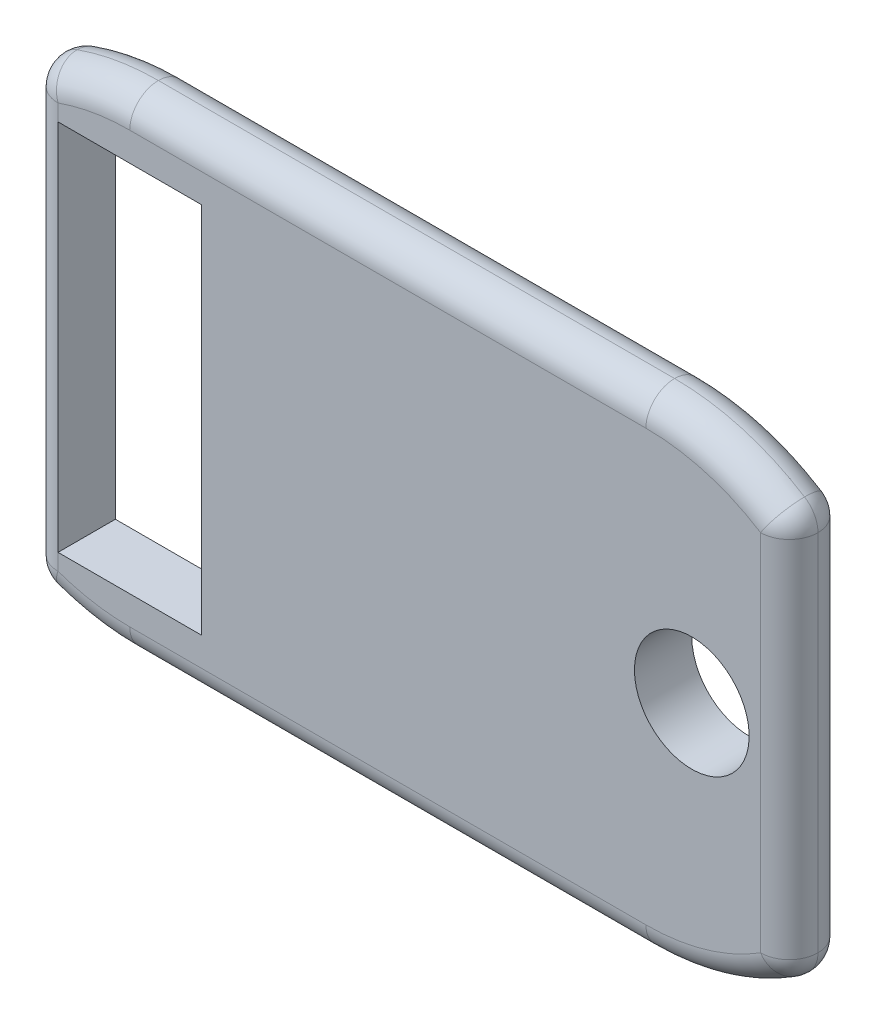
ISO-10303-21;
HEADER;
FILE_DESCRIPTION(('STEP AP214'),'2;1');
FILE_NAME('part.step','',(''),(''),'','','');
FILE_SCHEMA(('AUTOMOTIVE_DESIGN { 1 0 10303 214 1 1 1 1 }'));
ENDSEC;
DATA;
#1=APPLICATION_CONTEXT('core data for automotive mechanical design processes');
#2=APPLICATION_PROTOCOL_DEFINITION('international standard','automotive_design',2000,#1);
#3=PRODUCT_CONTEXT('',#1,'mechanical');
#4=PRODUCT('Part','Part','',(#3));
#5=PRODUCT_RELATED_PRODUCT_CATEGORY('part','',(#4));
#6=PRODUCT_DEFINITION_FORMATION('','',#4);
#7=PRODUCT_DEFINITION_CONTEXT('part definition',#1,'design');
#8=PRODUCT_DEFINITION('design','',#6,#7);
#9=PRODUCT_DEFINITION_SHAPE('','',#8);
#10=(LENGTH_UNIT() NAMED_UNIT(*) SI_UNIT(.MILLI.,.METRE.));
#11=(NAMED_UNIT(*) PLANE_ANGLE_UNIT() SI_UNIT($,.RADIAN.));
#12=(NAMED_UNIT(*) SI_UNIT($,.STERADIAN.) SOLID_ANGLE_UNIT());
#13=UNCERTAINTY_MEASURE_WITH_UNIT(LENGTH_MEASURE(1.E-05),#10,'distance_accuracy_value','');
#14=(GEOMETRIC_REPRESENTATION_CONTEXT(3) GLOBAL_UNCERTAINTY_ASSIGNED_CONTEXT((#13)) GLOBAL_UNIT_ASSIGNED_CONTEXT((#10,
#11,#12)) REPRESENTATION_CONTEXT('',''));
#15=CARTESIAN_POINT('',(0.,0.,0.));
#16=DIRECTION('',(0.,0.,1.));
#17=DIRECTION('',(1.,0.,0.));
#18=AXIS2_PLACEMENT_3D('',#15,#16,#17);
#19=CARTESIAN_POINT('',(38.6757267871688,-27.4690515955081,10.));
#20=DIRECTION('',(0.,0.,-1.));
#21=DIRECTION('',(-1.,0.,0.));
#22=AXIS2_PLACEMENT_3D('',#19,#20,#21);
#23=PLANE('',#22);
#24=DIRECTION('',(-1.,0.,0.));
#25=VECTOR('',#24,1.);
#26=CARTESIAN_POINT('',(38.6757267871688,-59.9690515955081,10.));
#27=LINE('',#26,#25);
#28=CARTESIAN_POINT('',(-38.8242732128312,-59.9690515955081,10.));
#29=VERTEX_POINT('',#28);
#30=CARTESIAN_POINT('',(-63.8242732128312,-59.9690515955081,10.));
#31=VERTEX_POINT('',#30);
#32=EDGE_CURVE('E321',#29,#31,#27,.T.);
#33=ORIENTED_EDGE('',*,*,#32,.T.);
#34=DIRECTION('',(0.,-1.,0.));
#35=VECTOR('',#34,1.);
#36=CARTESIAN_POINT('',(-63.8242732128312,-27.4690515955081,10.));
#37=LINE('',#36,#35);
#38=CARTESIAN_POINT('',(-63.8242732128312,-62.8243906548355,10.));
#39=VERTEX_POINT('',#38);
#40=EDGE_CURVE('E344',#31,#39,#37,.T.);
#41=ORIENTED_EDGE('',*,*,#40,.T.);
#42=CARTESIAN_POINT('',(-51.3242732128312,-27.4690515955081,10.));
#43=DIRECTION('',(0.,0.,-1.));
#44=DIRECTION('',(-1.,0.,0.));
#45=AXIS2_PLACEMENT_3D('',#42,#43,#44);
#46=CIRCLE('',#45,37.5);
#47=CARTESIAN_POINT('',(-51.3242732128312,-64.9690515955081,10.));
#48=VERTEX_POINT('',#47);
#49=EDGE_CURVE('E341',#39,#48,#46,.F.);
#50=ORIENTED_EDGE('',*,*,#49,.T.);
#51=DIRECTION('',(1.,0.,0.));
#52=VECTOR('',#51,1.);
#53=CARTESIAN_POINT('',(38.6757267871688,-64.9690515955081,10.));
#54=LINE('',#53,#52);
#55=CARTESIAN_POINT('',(38.6757267871688,-64.9690515955081,10.));
#56=VERTEX_POINT('',#55);
#57=EDGE_CURVE('E339',#48,#56,#54,.T.);
#58=ORIENTED_EDGE('',*,*,#57,.T.);
#59=CARTESIAN_POINT('',(38.6757267871688,-27.4690515955081,10.));
#60=DIRECTION('',(0.,0.,-1.));
#61=DIRECTION('',(-1.,0.,0.));
#62=AXIS2_PLACEMENT_3D('',#59,#60,#61);
#63=CIRCLE('',#62,37.5);
#64=CARTESIAN_POINT('',(58.6757267871688,-59.1904954466319,10.));
#65=VERTEX_POINT('',#64);
#66=EDGE_CURVE('E337',#56,#65,#63,.F.);
#67=ORIENTED_EDGE('',*,*,#66,.T.);
#68=DIRECTION('',(0.,1.,0.));
#69=VECTOR('',#68,1.);
#70=CARTESIAN_POINT('',(58.6757267871688,-27.4690515955081,10.));
#71=LINE('',#70,#69);
#72=CARTESIAN_POINT('',(58.6757267871688,4.25239225561574,10.));
#73=VERTEX_POINT('',#72);
#74=EDGE_CURVE('E335',#65,#73,#71,.T.);
#75=ORIENTED_EDGE('',*,*,#74,.T.);
#76=CARTESIAN_POINT('',(38.6757267871688,-27.4690515955081,10.));
#77=DIRECTION('',(0.,0.,-1.));
#78=DIRECTION('',(-1.,0.,0.));
#79=AXIS2_PLACEMENT_3D('',#76,#77,#78);
#80=CIRCLE('',#79,37.5);
#81=CARTESIAN_POINT('',(38.6757267871688,10.030948404492,10.));
#82=VERTEX_POINT('',#81);
#83=EDGE_CURVE('E333',#73,#82,#80,.F.);
#84=ORIENTED_EDGE('',*,*,#83,.T.);
#85=DIRECTION('',(-1.,0.,0.));
#86=VECTOR('',#85,1.);
#87=CARTESIAN_POINT('',(38.6757267871688,10.030948404492,10.));
#88=LINE('',#87,#86);
#89=CARTESIAN_POINT('',(-51.3242732128312,10.030948404492,10.));
#90=VERTEX_POINT('',#89);
#91=EDGE_CURVE('E329',#82,#90,#88,.T.);
#92=ORIENTED_EDGE('',*,*,#91,.T.);
#93=CARTESIAN_POINT('',(-51.3242732128312,-27.4690515955081,10.));
#94=DIRECTION('',(0.,0.,-1.));
#95=DIRECTION('',(-1.,0.,0.));
#96=AXIS2_PLACEMENT_3D('',#93,#94,#95);
#97=CIRCLE('',#96,37.5);
#98=CARTESIAN_POINT('',(-63.8242732128312,7.88628746381934,10.));
#99=VERTEX_POINT('',#98);
#100=EDGE_CURVE('E327',#90,#99,#97,.F.);
#101=ORIENTED_EDGE('',*,*,#100,.T.);
#102=DIRECTION('',(0.,-1.,0.));
#103=VECTOR('',#102,1.);
#104=CARTESIAN_POINT('',(-63.8242732128312,-27.4690515955081,10.));
#105=LINE('',#104,#103);
#106=CARTESIAN_POINT('',(-63.8242732128312,5.03094840449193,10.));
#107=VERTEX_POINT('',#106);
#108=EDGE_CURVE('E331',#99,#107,#105,.T.);
#109=ORIENTED_EDGE('',*,*,#108,.T.);
#110=DIRECTION('',(1.,0.,0.));
#111=VECTOR('',#110,1.);
#112=CARTESIAN_POINT('',(38.6757267871688,5.03094840449195,10.));
#113=LINE('',#112,#111);
#114=CARTESIAN_POINT('',(-38.8242732128312,5.03094840449194,10.));
#115=VERTEX_POINT('',#114);
#116=EDGE_CURVE('E310',#107,#115,#113,.T.);
#117=ORIENTED_EDGE('',*,*,#116,.T.);
#118=DIRECTION('',(0.,-1.,0.));
#119=VECTOR('',#118,1.);
#120=CARTESIAN_POINT('',(-38.8242732128312,-27.4690515955081,10.));
#121=LINE('',#120,#119);
#122=EDGE_CURVE('E318',#115,#29,#121,.T.);
#123=ORIENTED_EDGE('',*,*,#122,.T.);
#124=EDGE_LOOP('',(#33,#41,#50,#58,#67,#75,#84,#92,#101,#109,#117,#123));
#125=FACE_BOUND('',#124,.T.);
#126=CARTESIAN_POINT('',(46.6757267871688,-27.469051595508,10.));
#127=DIRECTION('',(0.,0.,-1.));
#128=DIRECTION('',(-1.,0.,0.));
#129=AXIS2_PLACEMENT_3D('',#126,#127,#128);
#130=CIRCLE('',#129,9.99999999999999);
#131=CARTESIAN_POINT('',(36.6757267871688,-27.469051595508,10.));
#132=VERTEX_POINT('',#131);
#133=EDGE_CURVE('E290',#132,#132,#130,.T.);
#134=ORIENTED_EDGE('',*,*,#133,.T.);
#135=EDGE_LOOP('',(#134));
#136=FACE_BOUND('',#135,.T.);
#137=ADVANCED_FACE('F32',(#125,#136),#23,.F.);
#138=CARTESIAN_POINT('',(38.6757267871688,-27.4690515955081,0.));
#139=DIRECTION('',(0.,0.,-1.));
#140=DIRECTION('',(-1.,0.,0.));
#141=AXIS2_PLACEMENT_3D('',#138,#139,#140);
#142=PLANE('',#141);
#143=CARTESIAN_POINT('',(46.6757267871688,-27.469051595508,0.));
#144=DIRECTION('',(0.,0.,-1.));
#145=DIRECTION('',(-1.,0.,0.));
#146=AXIS2_PLACEMENT_3D('',#143,#144,#145);
#147=CIRCLE('',#146,9.99999999999999);
#148=CARTESIAN_POINT('',(36.6757267871688,-27.469051595508,0.));
#149=VERTEX_POINT('',#148);
#150=EDGE_CURVE('E286',#149,#149,#147,.T.);
#151=ORIENTED_EDGE('',*,*,#150,.F.);
#152=EDGE_LOOP('',(#151));
#153=FACE_BOUND('',#152,.T.);
#154=CARTESIAN_POINT('',(-51.3242732128312,-27.4690515955081,0.));
#155=DIRECTION('',(0.,0.,-1.));
#156=DIRECTION('',(-1.,0.,0.));
#157=AXIS2_PLACEMENT_3D('',#154,#155,#156);
#158=CIRCLE('',#157,37.5);
#159=CARTESIAN_POINT('',(-51.3242732128312,-64.9690515955081,0.));
#160=VERTEX_POINT('',#159);
#161=CARTESIAN_POINT('',(-63.8242732128312,-62.8243906548355,0.));
#162=VERTEX_POINT('',#161);
#163=EDGE_CURVE('E42',#160,#162,#158,.T.);
#164=ORIENTED_EDGE('',*,*,#163,.T.);
#165=DIRECTION('',(0.,-1.,0.));
#166=VECTOR('',#165,1.);
#167=CARTESIAN_POINT('',(-63.8242732128312,11.2607818665661,0.));
#168=LINE('',#167,#166);
#169=CARTESIAN_POINT('',(-63.8242732128312,-59.9690515955081,0.));
#170=VERTEX_POINT('',#169);
#171=EDGE_CURVE('E11',#162,#170,#168,.F.);
#172=ORIENTED_EDGE('',*,*,#171,.T.);
#173=DIRECTION('',(-1.,0.,0.));
#174=VECTOR('',#173,1.);
#175=CARTESIAN_POINT('',(-38.8242732128312,-59.9690515955081,0.));
#176=LINE('',#175,#174);
#177=CARTESIAN_POINT('',(-38.8242732128312,-59.9690515955081,0.));
#178=VERTEX_POINT('',#177);
#179=EDGE_CURVE('E303',#178,#170,#176,.T.);
#180=ORIENTED_EDGE('',*,*,#179,.F.);
#181=DIRECTION('',(0.,-1.,0.));
#182=VECTOR('',#181,1.);
#183=CARTESIAN_POINT('',(-38.8242732128312,-59.9690515955081,0.));
#184=LINE('',#183,#182);
#185=CARTESIAN_POINT('',(-38.8242732128312,5.03094840449194,0.));
#186=VERTEX_POINT('',#185);
#187=EDGE_CURVE('E301',#186,#178,#184,.T.);
#188=ORIENTED_EDGE('',*,*,#187,.F.);
#189=DIRECTION('',(1.,0.,0.));
#190=VECTOR('',#189,1.);
#191=CARTESIAN_POINT('',(-38.8242732128312,5.03094840449194,0.));
#192=LINE('',#191,#190);
#193=CARTESIAN_POINT('',(-63.8242732128312,5.03094840449194,0.));
#194=VERTEX_POINT('',#193);
#195=EDGE_CURVE('E299',#194,#186,#192,.T.);
#196=ORIENTED_EDGE('',*,*,#195,.F.);
#197=DIRECTION('',(0.,-1.,0.));
#198=VECTOR('',#197,1.);
#199=CARTESIAN_POINT('',(-63.8242732128312,11.2607818665661,0.));
#200=LINE('',#199,#198);
#201=CARTESIAN_POINT('',(-63.8242732128312,7.88628746381934,0.));
#202=VERTEX_POINT('',#201);
#203=EDGE_CURVE('E350',#194,#202,#200,.F.);
#204=ORIENTED_EDGE('',*,*,#203,.T.);
#205=CARTESIAN_POINT('',(-51.3242732128312,-27.4690515955081,0.));
#206=DIRECTION('',(0.,0.,-1.));
#207=DIRECTION('',(-1.,0.,0.));
#208=AXIS2_PLACEMENT_3D('',#205,#206,#207);
#209=CIRCLE('',#208,37.5);
#210=CARTESIAN_POINT('',(-51.3242732128312,10.030948404492,0.));
#211=VERTEX_POINT('',#210);
#212=EDGE_CURVE('E346',#202,#211,#209,.T.);
#213=ORIENTED_EDGE('',*,*,#212,.T.);
#214=DIRECTION('',(-1.,0.,0.));
#215=VECTOR('',#214,1.);
#216=CARTESIAN_POINT('',(38.6757267871688,10.0309484044919,0.));
#217=LINE('',#216,#215);
#218=CARTESIAN_POINT('',(38.6757267871688,10.0309484044919,0.));
#219=VERTEX_POINT('',#218);
#220=EDGE_CURVE('E348',#211,#219,#217,.F.);
#221=ORIENTED_EDGE('',*,*,#220,.T.);
#222=CARTESIAN_POINT('',(38.6757267871688,-27.4690515955081,0.));
#223=DIRECTION('',(0.,0.,-1.));
#224=DIRECTION('',(-1.,0.,0.));
#225=AXIS2_PLACEMENT_3D('',#222,#223,#224);
#226=CIRCLE('',#225,37.5);
#227=CARTESIAN_POINT('',(58.6757267871688,4.25239225561574,0.));
#228=VERTEX_POINT('',#227);
#229=EDGE_CURVE('E352',#219,#228,#226,.T.);
#230=ORIENTED_EDGE('',*,*,#229,.T.);
#231=DIRECTION('',(0.,1.,0.));
#232=VECTOR('',#231,1.);
#233=CARTESIAN_POINT('',(58.6757267871688,-61.8383693076769,0.));
#234=LINE('',#233,#232);
#235=CARTESIAN_POINT('',(58.6757267871688,-59.1904954466319,0.));
#236=VERTEX_POINT('',#235);
#237=EDGE_CURVE('E174',#228,#236,#234,.F.);
#238=ORIENTED_EDGE('',*,*,#237,.T.);
#239=CARTESIAN_POINT('',(38.6757267871688,-27.4690515955081,0.));
#240=DIRECTION('',(0.,0.,-1.));
#241=DIRECTION('',(-1.,0.,0.));
#242=AXIS2_PLACEMENT_3D('',#239,#240,#241);
#243=CIRCLE('',#242,37.5);
#244=CARTESIAN_POINT('',(38.6757267871688,-64.9690515955081,0.));
#245=VERTEX_POINT('',#244);
#246=EDGE_CURVE('E166',#236,#245,#243,.T.);
#247=ORIENTED_EDGE('',*,*,#246,.T.);
#248=DIRECTION('',(1.,0.,0.));
#249=VECTOR('',#248,1.);
#250=CARTESIAN_POINT('',(-51.3242732128312,-64.9690515955081,0.));
#251=LINE('',#250,#249);
#252=EDGE_CURVE('E171',#245,#160,#251,.F.);
#253=ORIENTED_EDGE('',*,*,#252,.T.);
#254=EDGE_LOOP('',(#164,#172,#180,#188,#196,#204,#213,#221,#230,#238,#247,#253));
#255=FACE_BOUND('',#254,.T.);
#256=ADVANCED_FACE('F169',(#153,#255),#142,.T.);
#257=CARTESIAN_POINT('',(-63.8242732128312,-59.9690515955081,20.));
#258=DIRECTION('',(-1.,0.,0.));
#259=DIRECTION('',(0.,0.,1.));
#260=AXIS2_PLACEMENT_3D('',#257,#258,#259);
#261=PLANE('',#260);
#262=DIRECTION('',(0.,0.,-1.));
#263=VECTOR('',#262,1.);
#264=CARTESIAN_POINT('',(-63.8242732128312,-59.9690515955081,20.));
#265=LINE('',#264,#263);
#266=EDGE_CURVE('E307',#31,#170,#265,.T.);
#267=ORIENTED_EDGE('',*,*,#266,.T.);
#268=DIRECTION('',(0.,1.,0.));
#269=VECTOR('',#268,1.);
#270=CARTESIAN_POINT('',(-63.8242732128312,-59.9690515955081,0.));
#271=LINE('',#270,#269);
#272=EDGE_CURVE('E295',#170,#194,#271,.T.);
#273=ORIENTED_EDGE('',*,*,#272,.T.);
#274=DIRECTION('',(0.,0.,-1.));
#275=VECTOR('',#274,1.);
#276=CARTESIAN_POINT('',(-63.8242732128312,5.03094840449193,20.));
#277=LINE('',#276,#275);
#278=EDGE_CURVE('E306',#107,#194,#277,.T.);
#279=ORIENTED_EDGE('',*,*,#278,.F.);
#280=DIRECTION('',(0.,1.,0.));
#281=VECTOR('',#280,1.);
#282=CARTESIAN_POINT('',(-63.8242732128312,-27.4690515955081,10.));
#283=LINE('',#282,#281);
#284=EDGE_CURVE('E324',#31,#107,#283,.T.);
#285=ORIENTED_EDGE('',*,*,#284,.F.);
#286=EDGE_LOOP('',(#267,#273,#279,#285));
#287=FACE_BOUND('',#286,.T.);
#288=ADVANCED_FACE('F385',(#287),#261,.F.);
#289=CARTESIAN_POINT('',(-38.8242732128312,-59.9690515955081,20.));
#290=DIRECTION('',(0.,-1.,0.));
#291=DIRECTION('',(0.,0.,-1.));
#292=AXIS2_PLACEMENT_3D('',#289,#290,#291);
#293=PLANE('',#292);
#294=DIRECTION('',(0.,0.,-1.));
#295=VECTOR('',#294,1.);
#296=CARTESIAN_POINT('',(-38.8242732128312,-59.9690515955081,20.));
#297=LINE('',#296,#295);
#298=EDGE_CURVE('E311',#29,#178,#297,.T.);
#299=ORIENTED_EDGE('',*,*,#298,.T.);
#300=ORIENTED_EDGE('',*,*,#179,.T.);
#301=ORIENTED_EDGE('',*,*,#266,.F.);
#302=ORIENTED_EDGE('',*,*,#32,.F.);
#303=EDGE_LOOP('',(#299,#300,#301,#302));
#304=FACE_BOUND('',#303,.T.);
#305=ADVANCED_FACE('F388',(#304),#293,.F.);
#306=CARTESIAN_POINT('',(-38.8242732128312,-59.9690515955081,20.));
#307=DIRECTION('',(1.,0.,0.));
#308=DIRECTION('',(0.,0.,-1.));
#309=AXIS2_PLACEMENT_3D('',#306,#307,#308);
#310=PLANE('',#309);
#311=DIRECTION('',(0.,0.,-1.));
#312=VECTOR('',#311,1.);
#313=CARTESIAN_POINT('',(-38.8242732128312,5.03094840449194,20.));
#314=LINE('',#313,#312);
#315=EDGE_CURVE('E104',#115,#186,#314,.T.);
#316=ORIENTED_EDGE('',*,*,#315,.T.);
#317=ORIENTED_EDGE('',*,*,#187,.T.);
#318=ORIENTED_EDGE('',*,*,#298,.F.);
#319=ORIENTED_EDGE('',*,*,#122,.F.);
#320=EDGE_LOOP('',(#316,#317,#318,#319));
#321=FACE_BOUND('',#320,.T.);
#322=ADVANCED_FACE('F418',(#321),#310,.F.);
#323=CARTESIAN_POINT('',(-38.8242732128312,5.03094840449194,20.));
#324=DIRECTION('',(0.,1.,0.));
#325=DIRECTION('',(-1.,0.,0.));
#326=AXIS2_PLACEMENT_3D('',#323,#324,#325);
#327=PLANE('',#326);
#328=ORIENTED_EDGE('',*,*,#278,.T.);
#329=ORIENTED_EDGE('',*,*,#195,.T.);
#330=ORIENTED_EDGE('',*,*,#315,.F.);
#331=ORIENTED_EDGE('',*,*,#116,.F.);
#332=EDGE_LOOP('',(#328,#329,#330,#331));
#333=FACE_BOUND('',#332,.T.);
#334=ADVANCED_FACE('F417',(#333),#327,.F.);
#335=CARTESIAN_POINT('',(46.6757267871688,-27.469051595508,20.));
#336=DIRECTION('',(0.,0.,-1.));
#337=DIRECTION('',(-1.,0.,0.));
#338=AXIS2_PLACEMENT_3D('',#335,#336,#337);
#339=CYLINDRICAL_SURFACE('',#338,9.99999999999999);
#340=ORIENTED_EDGE('',*,*,#150,.T.);
#341=EDGE_LOOP('',(#340));
#342=FACE_BOUND('',#341,.T.);
#343=ORIENTED_EDGE('',*,*,#133,.F.);
#344=EDGE_LOOP('',(#343));
#345=FACE_BOUND('',#344,.T.);
#346=ADVANCED_FACE('F440',(#342,#345),#339,.F.);
#347=CARTESIAN_POINT('',(38.6757267871688,-27.4690515955081,5.));
#348=DIRECTION('',(0.,0.,-1.));
#349=DIRECTION('',(-1.,0.,0.));
#350=AXIS2_PLACEMENT_3D('',#347,#348,#349);
#351=TOROIDAL_SURFACE('',#350,37.5,5.);
#352=CARTESIAN_POINT('',(58.6757267871688,4.25239225561574,5.));
#353=DIRECTION('',(0.845905169363301,-0.533333333333334,0.));
#354=DIRECTION('',(0.533333333333334,0.845905169363301,0.));
#355=AXIS2_PLACEMENT_3D('',#352,#353,#354);
#356=CIRCLE('',#355,5.);
#357=CARTESIAN_POINT('',(61.3423934538355,8.48191810243224,5.));
#358=VERTEX_POINT('',#357);
#359=EDGE_CURVE('E280',#228,#358,#356,.T.);
#360=ORIENTED_EDGE('',*,*,#359,.F.);
#361=ORIENTED_EDGE('',*,*,#229,.F.);
#362=CARTESIAN_POINT('',(38.6757267871688,10.0309484044919,5.));
#363=DIRECTION('',(-1.,0.,0.));
#364=DIRECTION('',(0.,0.,1.));
#365=AXIS2_PLACEMENT_3D('',#362,#363,#364);
#366=CIRCLE('',#365,5.);
#367=CARTESIAN_POINT('',(38.6757267871688,15.0309484044919,5.));
#368=VERTEX_POINT('',#367);
#369=EDGE_CURVE('E36',#368,#219,#366,.T.);
#370=ORIENTED_EDGE('',*,*,#369,.F.);
#371=CARTESIAN_POINT('',(38.6757267871688,-27.4690515955081,5.));
#372=DIRECTION('',(0.,0.,-1.));
#373=DIRECTION('',(-1.,0.,0.));
#374=AXIS2_PLACEMENT_3D('',#371,#372,#373);
#375=CIRCLE('',#374,42.5);
#376=EDGE_CURVE('E95',#358,#368,#375,.F.);
#377=ORIENTED_EDGE('',*,*,#376,.F.);
#378=EDGE_LOOP('',(#360,#361,#370,#377));
#379=FACE_BOUND('',#378,.T.);
#380=ADVANCED_FACE('F34',(#379),#351,.T.);
#381=CARTESIAN_POINT('',(-51.3242732128312,10.030948404492,5.));
#382=DIRECTION('',(1.,0.,0.));
#383=DIRECTION('',(0.,1.,0.));
#384=AXIS2_PLACEMENT_3D('',#381,#382,#383);
#385=CYLINDRICAL_SURFACE('',#384,5.);
#386=ORIENTED_EDGE('',*,*,#369,.T.);
#387=ORIENTED_EDGE('',*,*,#220,.F.);
#388=CARTESIAN_POINT('',(-51.3242732128312,10.030948404492,5.));
#389=DIRECTION('',(-1.,0.,0.));
#390=DIRECTION('',(0.,0.,1.));
#391=AXIS2_PLACEMENT_3D('',#388,#389,#390);
#392=CIRCLE('',#391,5.);
#393=CARTESIAN_POINT('',(-51.3242732128312,15.030948404492,5.));
#394=VERTEX_POINT('',#393);
#395=EDGE_CURVE('E277',#394,#211,#392,.T.);
#396=ORIENTED_EDGE('',*,*,#395,.F.);
#397=DIRECTION('',(-1.,0.,0.));
#398=VECTOR('',#397,1.);
#399=CARTESIAN_POINT('',(-51.3242732128312,15.030948404492,5.));
#400=LINE('',#399,#398);
#401=EDGE_CURVE('E274',#368,#394,#400,.T.);
#402=ORIENTED_EDGE('',*,*,#401,.F.);
#403=EDGE_LOOP('',(#386,#387,#396,#402));
#404=FACE_BOUND('',#403,.T.);
#405=ADVANCED_FACE('F433',(#404),#385,.T.);
#406=CARTESIAN_POINT('',(38.6757267871688,-27.4690515955081,5.));
#407=DIRECTION('',(0.,0.,-1.));
#408=DIRECTION('',(-1.,0.,0.));
#409=AXIS2_PLACEMENT_3D('',#406,#407,#408);
#410=TOROIDAL_SURFACE('',#409,37.5,5.);
#411=CARTESIAN_POINT('',(58.6757267871688,4.25239225561573,5.));
#412=DIRECTION('',(0.845905169363301,-0.533333333333334,0.));
#413=DIRECTION('',(0.533333333333334,0.845905169363301,0.));
#414=AXIS2_PLACEMENT_3D('',#411,#412,#413);
#415=CIRCLE('',#414,5.);
#416=EDGE_CURVE('E268',#358,#73,#415,.T.);
#417=ORIENTED_EDGE('',*,*,#416,.F.);
#418=ORIENTED_EDGE('',*,*,#376,.T.);
#419=CARTESIAN_POINT('',(38.6757267871688,10.0309484044919,5.));
#420=DIRECTION('',(-1.,0.,0.));
#421=DIRECTION('',(0.,0.,1.));
#422=AXIS2_PLACEMENT_3D('',#419,#420,#421);
#423=CIRCLE('',#422,5.);
#424=EDGE_CURVE('E271',#82,#368,#423,.T.);
#425=ORIENTED_EDGE('',*,*,#424,.F.);
#426=ORIENTED_EDGE('',*,*,#83,.F.);
#427=EDGE_LOOP('',(#417,#418,#425,#426));
#428=FACE_BOUND('',#427,.T.);
#429=ADVANCED_FACE('F429',(#428),#410,.T.);
#430=CARTESIAN_POINT('',(58.6757267871688,4.25239225561574,5.));
#431=DIRECTION('',(0.,0.,1.));
#432=DIRECTION('',(1.,0.,0.));
#433=AXIS2_PLACEMENT_3D('',#430,#431,#432);
#434=SPHERICAL_SURFACE('',#433,5.);
#435=ORIENTED_EDGE('',*,*,#359,.T.);
#436=CARTESIAN_POINT('',(58.6757267871688,4.25239225561574,5.));
#437=DIRECTION('',(0.,0.,1.));
#438=DIRECTION('',(1.,0.,0.));
#439=AXIS2_PLACEMENT_3D('',#436,#437,#438);
#440=CIRCLE('',#439,5.);
#441=CARTESIAN_POINT('',(63.6757267871688,4.25239225561574,5.));
#442=VERTEX_POINT('',#441);
#443=EDGE_CURVE('E266',#442,#358,#440,.T.);
#444=ORIENTED_EDGE('',*,*,#443,.F.);
#445=CARTESIAN_POINT('',(58.6757267871688,4.25239225561574,5.));
#446=DIRECTION('',(0.,1.,0.));
#447=DIRECTION('',(0.,0.,1.));
#448=AXIS2_PLACEMENT_3D('',#445,#446,#447);
#449=CIRCLE('',#448,5.);
#450=EDGE_CURVE('E263',#228,#442,#449,.F.);
#451=ORIENTED_EDGE('',*,*,#450,.F.);
#452=EDGE_LOOP('',(#435,#444,#451));
#453=FACE_BOUND('',#452,.T.);
#454=ADVANCED_FACE('F355',(#453),#434,.T.);
#455=CARTESIAN_POINT('',(-51.3242732128312,-27.4690515955081,5.));
#456=DIRECTION('',(0.,0.,-1.));
#457=DIRECTION('',(-1.,0.,0.));
#458=AXIS2_PLACEMENT_3D('',#455,#456,#457);
#459=TOROIDAL_SURFACE('',#458,37.5,5.);
#460=ORIENTED_EDGE('',*,*,#395,.T.);
#461=ORIENTED_EDGE('',*,*,#212,.F.);
#462=CARTESIAN_POINT('',(-63.8242732128312,7.88628746381933,5.));
#463=DIRECTION('',(-0.942809041582064,-0.333333333333333,0.));
#464=DIRECTION('',(0.333333333333333,-0.942809041582064,0.));
#465=AXIS2_PLACEMENT_3D('',#462,#463,#464);
#466=CIRCLE('',#465,5.);
#467=CARTESIAN_POINT('',(-65.4909398794978,12.6003326717296,5.));
#468=VERTEX_POINT('',#467);
#469=EDGE_CURVE('E260',#468,#202,#466,.T.);
#470=ORIENTED_EDGE('',*,*,#469,.F.);
#471=CARTESIAN_POINT('',(-51.3242732128312,-27.4690515955081,5.));
#472=DIRECTION('',(0.,0.,-1.));
#473=DIRECTION('',(-1.,0.,0.));
#474=AXIS2_PLACEMENT_3D('',#471,#472,#473);
#475=CIRCLE('',#474,42.5);
#476=EDGE_CURVE('E254',#394,#468,#475,.F.);
#477=ORIENTED_EDGE('',*,*,#476,.F.);
#478=EDGE_LOOP('',(#460,#461,#470,#477));
#479=FACE_BOUND('',#478,.T.);
#480=ADVANCED_FACE('F396',(#479),#459,.T.);
#481=CARTESIAN_POINT('',(38.6757267871688,10.030948404492,5.));
#482=DIRECTION('',(-1.,0.,0.));
#483=DIRECTION('',(0.,-1.,0.));
#484=AXIS2_PLACEMENT_3D('',#481,#482,#483);
#485=CYLINDRICAL_SURFACE('',#484,5.);
#486=ORIENTED_EDGE('',*,*,#424,.T.);
#487=ORIENTED_EDGE('',*,*,#401,.T.);
#488=CARTESIAN_POINT('',(-51.3242732128312,10.030948404492,5.));
#489=DIRECTION('',(-1.,0.,0.));
#490=DIRECTION('',(0.,0.,1.));
#491=AXIS2_PLACEMENT_3D('',#488,#489,#490);
#492=CIRCLE('',#491,5.);
#493=EDGE_CURVE('E251',#90,#394,#492,.T.);
#494=ORIENTED_EDGE('',*,*,#493,.F.);
#495=ORIENTED_EDGE('',*,*,#91,.F.);
#496=EDGE_LOOP('',(#486,#487,#494,#495));
#497=FACE_BOUND('',#496,.T.);
#498=ADVANCED_FACE('F432',(#497),#485,.T.);
#499=CARTESIAN_POINT('',(58.6757267871688,4.25239225561574,5.));
#500=DIRECTION('',(0.,0.,1.));
#501=DIRECTION('',(1.,0.,0.));
#502=AXIS2_PLACEMENT_3D('',#499,#500,#501);
#503=SPHERICAL_SURFACE('',#502,5.);
#504=ORIENTED_EDGE('',*,*,#443,.T.);
#505=ORIENTED_EDGE('',*,*,#416,.T.);
#506=CARTESIAN_POINT('',(58.6757267871688,4.25239225561574,5.));
#507=DIRECTION('',(0.,1.,0.));
#508=DIRECTION('',(-1.,0.,0.));
#509=AXIS2_PLACEMENT_3D('',#506,#507,#508);
#510=CIRCLE('',#509,5.);
#511=EDGE_CURVE('E248',#442,#73,#510,.F.);
#512=ORIENTED_EDGE('',*,*,#511,.F.);
#513=EDGE_LOOP('',(#504,#505,#512));
#514=FACE_BOUND('',#513,.T.);
#515=ADVANCED_FACE('F428',(#514),#503,.T.);
#516=CARTESIAN_POINT('',(58.6757267871688,-61.8383693076769,5.));
#517=DIRECTION('',(0.,-1.,0.));
#518=DIRECTION('',(0.,0.,-1.));
#519=AXIS2_PLACEMENT_3D('',#516,#517,#518);
#520=CYLINDRICAL_SURFACE('',#519,5.);
#521=ORIENTED_EDGE('',*,*,#237,.F.);
#522=ORIENTED_EDGE('',*,*,#450,.T.);
#523=DIRECTION('',(0.,1.,0.));
#524=VECTOR('',#523,1.);
#525=CARTESIAN_POINT('',(63.6757267871688,6.90026611666073,5.));
#526=LINE('',#525,#524);
#527=CARTESIAN_POINT('',(63.6757267871688,-59.1904954466319,5.));
#528=VERTEX_POINT('',#527);
#529=EDGE_CURVE('E245',#528,#442,#526,.T.);
#530=ORIENTED_EDGE('',*,*,#529,.F.);
#531=CARTESIAN_POINT('',(58.6757267871688,-59.1904954466319,5.));
#532=DIRECTION('',(0.,-1.,0.));
#533=DIRECTION('',(1.,0.,0.));
#534=AXIS2_PLACEMENT_3D('',#531,#532,#533);
#535=CIRCLE('',#534,5.);
#536=EDGE_CURVE('E242',#236,#528,#535,.T.);
#537=ORIENTED_EDGE('',*,*,#536,.F.);
#538=EDGE_LOOP('',(#521,#522,#530,#537));
#539=FACE_BOUND('',#538,.T.);
#540=ADVANCED_FACE('F358',(#539),#520,.T.);
#541=CARTESIAN_POINT('',(-63.8242732128312,7.88628746381934,5.));
#542=DIRECTION('',(0.,0.,1.));
#543=DIRECTION('',(1.,0.,0.));
#544=AXIS2_PLACEMENT_3D('',#541,#542,#543);
#545=SPHERICAL_SURFACE('',#544,5.);
#546=CARTESIAN_POINT('',(-63.8242732128312,7.88628746381934,5.));
#547=DIRECTION('',(0.,0.,-1.));
#548=DIRECTION('',(-1.,0.,0.));
#549=AXIS2_PLACEMENT_3D('',#546,#547,#548);
#550=CIRCLE('',#549,5.);
#551=CARTESIAN_POINT('',(-68.8242732128312,7.88628746381934,5.));
#552=VERTEX_POINT('',#551);
#553=EDGE_CURVE('E257',#468,#552,#550,.F.);
#554=ORIENTED_EDGE('',*,*,#553,.F.);
#555=ORIENTED_EDGE('',*,*,#469,.T.);
#556=CARTESIAN_POINT('',(-63.8242732128312,7.88628746381934,5.));
#557=DIRECTION('',(0.,1.,0.));
#558=DIRECTION('',(-1.,0.,0.));
#559=AXIS2_PLACEMENT_3D('',#556,#557,#558);
#560=CIRCLE('',#559,5.);
#561=EDGE_CURVE('E239',#552,#202,#560,.F.);
#562=ORIENTED_EDGE('',*,*,#561,.F.);
#563=EDGE_LOOP('',(#554,#555,#562));
#564=FACE_BOUND('',#563,.T.);
#565=ADVANCED_FACE('F400',(#564),#545,.T.);
#566=CARTESIAN_POINT('',(-51.3242732128312,-27.4690515955081,5.));
#567=DIRECTION('',(0.,0.,-1.));
#568=DIRECTION('',(-1.,0.,0.));
#569=AXIS2_PLACEMENT_3D('',#566,#567,#568);
#570=TOROIDAL_SURFACE('',#569,37.5,5.);
#571=ORIENTED_EDGE('',*,*,#493,.T.);
#572=ORIENTED_EDGE('',*,*,#476,.T.);
#573=CARTESIAN_POINT('',(-63.8242732128312,7.88628746381934,5.));
#574=DIRECTION('',(-0.942809041582063,-0.333333333333333,0.));
#575=DIRECTION('',(0.333333333333333,-0.942809041582063,0.));
#576=AXIS2_PLACEMENT_3D('',#573,#574,#575);
#577=CIRCLE('',#576,5.);
#578=EDGE_CURVE('E236',#99,#468,#577,.T.);
#579=ORIENTED_EDGE('',*,*,#578,.F.);
#580=ORIENTED_EDGE('',*,*,#100,.F.);
#581=EDGE_LOOP('',(#571,#572,#579,#580));
#582=FACE_BOUND('',#581,.T.);
#583=ADVANCED_FACE('F405',(#582),#570,.T.);
#584=CARTESIAN_POINT('',(58.6757267871688,-27.4690515955081,5.));
#585=DIRECTION('',(0.,1.,0.));
#586=DIRECTION('',(0.,0.,1.));
#587=AXIS2_PLACEMENT_3D('',#584,#585,#586);
#588=CYLINDRICAL_SURFACE('',#587,5.);
#589=CARTESIAN_POINT('',(58.6757267871688,-59.1904954466319,5.));
#590=DIRECTION('',(0.,-1.,0.));
#591=DIRECTION('',(0.,0.,-1.));
#592=AXIS2_PLACEMENT_3D('',#589,#590,#591);
#593=CIRCLE('',#592,5.);
#594=EDGE_CURVE('E233',#528,#65,#593,.T.);
#595=ORIENTED_EDGE('',*,*,#594,.F.);
#596=ORIENTED_EDGE('',*,*,#529,.T.);
#597=ORIENTED_EDGE('',*,*,#511,.T.);
#598=ORIENTED_EDGE('',*,*,#74,.F.);
#599=EDGE_LOOP('',(#595,#596,#597,#598));
#600=FACE_BOUND('',#599,.T.);
#601=ADVANCED_FACE('F426',(#600),#588,.T.);
#602=CARTESIAN_POINT('',(58.6757267871688,-59.1904954466319,5.));
#603=DIRECTION('',(0.,0.,1.));
#604=DIRECTION('',(1.,0.,0.));
#605=AXIS2_PLACEMENT_3D('',#602,#603,#604);
#606=SPHERICAL_SURFACE('',#605,5.);
#607=ORIENTED_EDGE('',*,*,#536,.T.);
#608=CARTESIAN_POINT('',(58.6757267871688,-59.1904954466319,5.));
#609=DIRECTION('',(0.,0.,1.));
#610=DIRECTION('',(1.,0.,0.));
#611=AXIS2_PLACEMENT_3D('',#608,#609,#610);
#612=CIRCLE('',#611,5.);
#613=CARTESIAN_POINT('',(61.3423934538355,-63.4200212934484,5.));
#614=VERTEX_POINT('',#613);
#615=EDGE_CURVE('E230',#614,#528,#612,.T.);
#616=ORIENTED_EDGE('',*,*,#615,.F.);
#617=CARTESIAN_POINT('',(58.6757267871688,-59.1904954466319,5.));
#618=DIRECTION('',(0.845905169363301,0.533333333333334,0.));
#619=DIRECTION('',(-0.533333333333334,0.845905169363301,0.));
#620=AXIS2_PLACEMENT_3D('',#617,#618,#619);
#621=CIRCLE('',#620,5.);
#622=EDGE_CURVE('E228',#236,#614,#621,.F.);
#623=ORIENTED_EDGE('',*,*,#622,.F.);
#624=EDGE_LOOP('',(#607,#616,#623));
#625=FACE_BOUND('',#624,.T.);
#626=ADVANCED_FACE('F361',(#625),#606,.T.);
#627=CARTESIAN_POINT('',(-63.8242732128312,-66.1988850575822,5.));
#628=DIRECTION('',(0.,1.,0.));
#629=DIRECTION('',(0.,0.,1.));
#630=AXIS2_PLACEMENT_3D('',#627,#628,#629);
#631=CYLINDRICAL_SURFACE('',#630,5.);
#632=ORIENTED_EDGE('',*,*,#272,.F.);
#633=ORIENTED_EDGE('',*,*,#171,.F.);
#634=CARTESIAN_POINT('',(-63.8242732128312,-62.8243906548355,5.));
#635=DIRECTION('',(0.,-1.,0.));
#636=DIRECTION('',(0.,0.,-1.));
#637=AXIS2_PLACEMENT_3D('',#634,#635,#636);
#638=CIRCLE('',#637,5.);
#639=CARTESIAN_POINT('',(-68.8242732128312,-62.8243906548355,5.));
#640=VERTEX_POINT('',#639);
#641=EDGE_CURVE('E226',#640,#162,#638,.T.);
#642=ORIENTED_EDGE('',*,*,#641,.F.);
#643=DIRECTION('',(0.,-1.,0.));
#644=VECTOR('',#643,1.);
#645=CARTESIAN_POINT('',(-68.8242732128312,-66.1988850575822,5.));
#646=LINE('',#645,#644);
#647=EDGE_CURVE('E220',#552,#640,#646,.T.);
#648=ORIENTED_EDGE('',*,*,#647,.F.);
#649=ORIENTED_EDGE('',*,*,#561,.T.);
#650=ORIENTED_EDGE('',*,*,#203,.F.);
#651=EDGE_LOOP('',(#632,#633,#642,#648,#649,#650));
#652=FACE_BOUND('',#651,.T.);
#653=ADVANCED_FACE('F391',(#652),#631,.T.);
#654=CARTESIAN_POINT('',(-63.8242732128312,7.88628746381934,5.));
#655=DIRECTION('',(0.,0.,1.));
#656=DIRECTION('',(1.,0.,0.));
#657=AXIS2_PLACEMENT_3D('',#654,#655,#656);
#658=SPHERICAL_SURFACE('',#657,5.);
#659=ORIENTED_EDGE('',*,*,#578,.T.);
#660=ORIENTED_EDGE('',*,*,#553,.T.);
#661=CARTESIAN_POINT('',(-63.8242732128312,7.88628746381934,5.));
#662=DIRECTION('',(0.,1.,0.));
#663=DIRECTION('',(0.,0.,1.));
#664=AXIS2_PLACEMENT_3D('',#661,#662,#663);
#665=CIRCLE('',#664,5.);
#666=EDGE_CURVE('E217',#99,#552,#665,.F.);
#667=ORIENTED_EDGE('',*,*,#666,.F.);
#668=EDGE_LOOP('',(#659,#660,#667));
#669=FACE_BOUND('',#668,.T.);
#670=ADVANCED_FACE('F408',(#669),#658,.T.);
#671=CARTESIAN_POINT('',(58.6757267871688,-59.1904954466319,5.));
#672=DIRECTION('',(0.,0.,1.));
#673=DIRECTION('',(1.,0.,0.));
#674=AXIS2_PLACEMENT_3D('',#671,#672,#673);
#675=SPHERICAL_SURFACE('',#674,5.);
#676=ORIENTED_EDGE('',*,*,#615,.T.);
#677=ORIENTED_EDGE('',*,*,#594,.T.);
#678=CARTESIAN_POINT('',(58.6757267871688,-59.1904954466319,5.));
#679=DIRECTION('',(0.8459051693633,0.533333333333335,0.));
#680=DIRECTION('',(-0.533333333333335,0.845905169363301,0.));
#681=AXIS2_PLACEMENT_3D('',#678,#679,#680);
#682=CIRCLE('',#681,5.);
#683=EDGE_CURVE('E214',#614,#65,#682,.F.);
#684=ORIENTED_EDGE('',*,*,#683,.F.);
#685=EDGE_LOOP('',(#676,#677,#684));
#686=FACE_BOUND('',#685,.T.);
#687=ADVANCED_FACE('F364',(#686),#675,.T.);
#688=CARTESIAN_POINT('',(38.6757267871688,-27.4690515955081,5.));
#689=DIRECTION('',(0.,0.,-1.));
#690=DIRECTION('',(-1.,0.,0.));
#691=AXIS2_PLACEMENT_3D('',#688,#689,#690);
#692=TOROIDAL_SURFACE('',#691,37.5,5.);
#693=ORIENTED_EDGE('',*,*,#246,.F.);
#694=ORIENTED_EDGE('',*,*,#622,.T.);
#695=CARTESIAN_POINT('',(38.6757267871688,-27.4690515955081,5.));
#696=DIRECTION('',(0.,0.,-1.));
#697=DIRECTION('',(-1.,0.,0.));
#698=AXIS2_PLACEMENT_3D('',#695,#696,#697);
#699=CIRCLE('',#698,42.5);
#700=CARTESIAN_POINT('',(38.6757267871688,-69.9690515955081,5.));
#701=VERTEX_POINT('',#700);
#702=EDGE_CURVE('E183',#701,#614,#699,.F.);
#703=ORIENTED_EDGE('',*,*,#702,.F.);
#704=CARTESIAN_POINT('',(38.6757267871688,-64.9690515955081,5.));
#705=DIRECTION('',(-1.,0.,0.));
#706=DIRECTION('',(0.,0.,1.));
#707=AXIS2_PLACEMENT_3D('',#704,#705,#706);
#708=CIRCLE('',#707,5.);
#709=EDGE_CURVE('E180',#245,#701,#708,.T.);
#710=ORIENTED_EDGE('',*,*,#709,.F.);
#711=EDGE_LOOP('',(#693,#694,#703,#710));
#712=FACE_BOUND('',#711,.T.);
#713=ADVANCED_FACE('F181',(#712),#692,.T.);
#714=CARTESIAN_POINT('',(-63.8242732128312,-62.8243906548355,5.));
#715=DIRECTION('',(0.,0.,1.));
#716=DIRECTION('',(1.,0.,0.));
#717=AXIS2_PLACEMENT_3D('',#714,#715,#716);
#718=SPHERICAL_SURFACE('',#717,5.);
#719=CARTESIAN_POINT('',(-63.8242732128312,-62.8243906548355,5.));
#720=DIRECTION('',(0.,0.,-1.));
#721=DIRECTION('',(-1.,0.,0.));
#722=AXIS2_PLACEMENT_3D('',#719,#720,#721);
#723=CIRCLE('',#722,5.);
#724=CARTESIAN_POINT('',(-65.4909398794978,-67.5384358627458,5.));
#725=VERTEX_POINT('',#724);
#726=EDGE_CURVE('E223',#640,#725,#723,.F.);
#727=ORIENTED_EDGE('',*,*,#726,.F.);
#728=ORIENTED_EDGE('',*,*,#641,.T.);
#729=CARTESIAN_POINT('',(-63.8242732128312,-62.8243906548355,5.));
#730=DIRECTION('',(-0.942809041582064,0.333333333333333,0.));
#731=DIRECTION('',(-0.333333333333333,-0.942809041582064,0.));
#732=AXIS2_PLACEMENT_3D('',#729,#730,#731);
#733=CIRCLE('',#732,5.);
#734=EDGE_CURVE('E51',#725,#162,#733,.F.);
#735=ORIENTED_EDGE('',*,*,#734,.F.);
#736=EDGE_LOOP('',(#727,#728,#735));
#737=FACE_BOUND('',#736,.T.);
#738=ADVANCED_FACE('F465',(#737),#718,.T.);
#739=CARTESIAN_POINT('',(-63.8242732128312,-27.4690515955081,5.));
#740=DIRECTION('',(0.,-1.,0.));
#741=DIRECTION('',(0.,0.,-1.));
#742=AXIS2_PLACEMENT_3D('',#739,#740,#741);
#743=CYLINDRICAL_SURFACE('',#742,5.);
#744=ORIENTED_EDGE('',*,*,#666,.T.);
#745=ORIENTED_EDGE('',*,*,#647,.T.);
#746=CARTESIAN_POINT('',(-63.8242732128312,-62.8243906548355,5.));
#747=DIRECTION('',(0.,-1.,0.));
#748=DIRECTION('',(0.,0.,-1.));
#749=AXIS2_PLACEMENT_3D('',#746,#747,#748);
#750=CIRCLE('',#749,5.);
#751=EDGE_CURVE('E208',#39,#640,#750,.T.);
#752=ORIENTED_EDGE('',*,*,#751,.F.);
#753=ORIENTED_EDGE('',*,*,#40,.F.);
#754=ORIENTED_EDGE('',*,*,#284,.T.);
#755=ORIENTED_EDGE('',*,*,#108,.F.);
#756=EDGE_LOOP('',(#744,#745,#752,#753,#754,#755));
#757=FACE_BOUND('',#756,.T.);
#758=ADVANCED_FACE('F411',(#757),#743,.T.);
#759=CARTESIAN_POINT('',(38.6757267871688,-27.4690515955081,5.));
#760=DIRECTION('',(0.,0.,-1.));
#761=DIRECTION('',(-1.,0.,0.));
#762=AXIS2_PLACEMENT_3D('',#759,#760,#761);
#763=TOROIDAL_SURFACE('',#762,37.5,5.);
#764=ORIENTED_EDGE('',*,*,#683,.T.);
#765=ORIENTED_EDGE('',*,*,#66,.F.);
#766=CARTESIAN_POINT('',(38.6757267871688,-64.9690515955081,5.));
#767=DIRECTION('',(-1.,0.,0.));
#768=DIRECTION('',(0.,0.,1.));
#769=AXIS2_PLACEMENT_3D('',#766,#767,#768);
#770=CIRCLE('',#769,5.);
#771=EDGE_CURVE('E205',#701,#56,#770,.T.);
#772=ORIENTED_EDGE('',*,*,#771,.F.);
#773=ORIENTED_EDGE('',*,*,#702,.T.);
#774=EDGE_LOOP('',(#764,#765,#772,#773));
#775=FACE_BOUND('',#774,.T.);
#776=ADVANCED_FACE('F368',(#775),#763,.T.);
#777=CARTESIAN_POINT('',(38.6757267871688,-64.9690515955081,5.));
#778=DIRECTION('',(-1.,0.,0.));
#779=DIRECTION('',(0.,0.,1.));
#780=AXIS2_PLACEMENT_3D('',#777,#778,#779);
#781=CYLINDRICAL_SURFACE('',#780,5.);
#782=CARTESIAN_POINT('',(-51.3242732128312,-64.9690515955081,5.));
#783=DIRECTION('',(-1.,0.,0.));
#784=DIRECTION('',(0.,0.,1.));
#785=AXIS2_PLACEMENT_3D('',#782,#783,#784);
#786=CIRCLE('',#785,5.);
#787=CARTESIAN_POINT('',(-51.3242732128312,-69.9690515955081,5.));
#788=VERTEX_POINT('',#787);
#789=EDGE_CURVE('E187',#160,#788,#786,.T.);
#790=ORIENTED_EDGE('',*,*,#789,.F.);
#791=ORIENTED_EDGE('',*,*,#252,.F.);
#792=ORIENTED_EDGE('',*,*,#709,.T.);
#793=DIRECTION('',(1.,0.,0.));
#794=VECTOR('',#793,1.);
#795=CARTESIAN_POINT('',(38.6757267871688,-69.9690515955081,5.));
#796=LINE('',#795,#794);
#797=EDGE_CURVE('E202',#788,#701,#796,.T.);
#798=ORIENTED_EDGE('',*,*,#797,.F.);
#799=EDGE_LOOP('',(#790,#791,#792,#798));
#800=FACE_BOUND('',#799,.T.);
#801=ADVANCED_FACE('F189',(#800),#781,.T.);
#802=CARTESIAN_POINT('',(-51.3242732128312,-27.4690515955081,5.));
#803=DIRECTION('',(0.,0.,-1.));
#804=DIRECTION('',(-1.,0.,0.));
#805=AXIS2_PLACEMENT_3D('',#802,#803,#804);
#806=TOROIDAL_SURFACE('',#805,37.5,5.);
#807=ORIENTED_EDGE('',*,*,#163,.F.);
#808=ORIENTED_EDGE('',*,*,#789,.T.);
#809=CARTESIAN_POINT('',(-51.3242732128312,-27.4690515955081,5.));
#810=DIRECTION('',(0.,0.,-1.));
#811=DIRECTION('',(-1.,0.,0.));
#812=AXIS2_PLACEMENT_3D('',#809,#810,#811);
#813=CIRCLE('',#812,42.5);
#814=EDGE_CURVE('E199',#725,#788,#813,.F.);
#815=ORIENTED_EDGE('',*,*,#814,.F.);
#816=ORIENTED_EDGE('',*,*,#734,.T.);
#817=EDGE_LOOP('',(#807,#808,#815,#816));
#818=FACE_BOUND('',#817,.T.);
#819=ADVANCED_FACE('F377',(#818),#806,.T.);
#820=CARTESIAN_POINT('',(-63.8242732128312,-62.8243906548355,5.));
#821=DIRECTION('',(0.,0.,1.));
#822=DIRECTION('',(1.,0.,0.));
#823=AXIS2_PLACEMENT_3D('',#820,#821,#822);
#824=SPHERICAL_SURFACE('',#823,5.);
#825=ORIENTED_EDGE('',*,*,#751,.T.);
#826=ORIENTED_EDGE('',*,*,#726,.T.);
#827=CARTESIAN_POINT('',(-63.8242732128312,-62.8243906548355,5.));
#828=DIRECTION('',(-0.942809041582064,0.333333333333333,0.));
#829=DIRECTION('',(-0.333333333333333,-0.942809041582064,0.));
#830=AXIS2_PLACEMENT_3D('',#827,#828,#829);
#831=CIRCLE('',#830,5.);
#832=EDGE_CURVE('E196',#39,#725,#831,.F.);
#833=ORIENTED_EDGE('',*,*,#832,.F.);
#834=EDGE_LOOP('',(#825,#826,#833));
#835=FACE_BOUND('',#834,.T.);
#836=ADVANCED_FACE('F421',(#835),#824,.T.);
#837=CARTESIAN_POINT('',(38.6757267871688,-64.9690515955081,5.));
#838=DIRECTION('',(1.,0.,0.));
#839=DIRECTION('',(0.,0.,-1.));
#840=AXIS2_PLACEMENT_3D('',#837,#838,#839);
#841=CYLINDRICAL_SURFACE('',#840,5.);
#842=ORIENTED_EDGE('',*,*,#771,.T.);
#843=ORIENTED_EDGE('',*,*,#57,.F.);
#844=CARTESIAN_POINT('',(-51.3242732128312,-64.9690515955081,5.));
#845=DIRECTION('',(-1.,0.,0.));
#846=DIRECTION('',(0.,0.,1.));
#847=AXIS2_PLACEMENT_3D('',#844,#845,#846);
#848=CIRCLE('',#847,5.);
#849=EDGE_CURVE('E194',#788,#48,#848,.T.);
#850=ORIENTED_EDGE('',*,*,#849,.F.);
#851=ORIENTED_EDGE('',*,*,#797,.T.);
#852=EDGE_LOOP('',(#842,#843,#850,#851));
#853=FACE_BOUND('',#852,.T.);
#854=ADVANCED_FACE('F372',(#853),#841,.T.);
#855=CARTESIAN_POINT('',(-51.3242732128312,-27.4690515955081,5.));
#856=DIRECTION('',(0.,0.,-1.));
#857=DIRECTION('',(-1.,0.,0.));
#858=AXIS2_PLACEMENT_3D('',#855,#856,#857);
#859=TOROIDAL_SURFACE('',#858,37.5,5.);
#860=ORIENTED_EDGE('',*,*,#832,.T.);
#861=ORIENTED_EDGE('',*,*,#814,.T.);
#862=ORIENTED_EDGE('',*,*,#849,.T.);
#863=ORIENTED_EDGE('',*,*,#49,.F.);
#864=EDGE_LOOP('',(#860,#861,#862,#863));
#865=FACE_BOUND('',#864,.T.);
#866=ADVANCED_FACE('F374',(#865),#859,.T.);
#867=CLOSED_SHELL('',(#137,#256,#288,#305,#322,#334,#346,#380,#405,#429,#454,#480,#498,#515,
#540,#565,#583,#601,#626,#653,#670,#687,#713,#738,#758,#776,#801,#819,#836,#854,#866));
#868=MANIFOLD_SOLID_BREP('B2',#867);
#869=ADVANCED_BREP_SHAPE_REPRESENTATION('',(#18,#868),#14);
#870=SHAPE_DEFINITION_REPRESENTATION(#9,#869);
ENDSEC;
END-ISO-10303-21;
